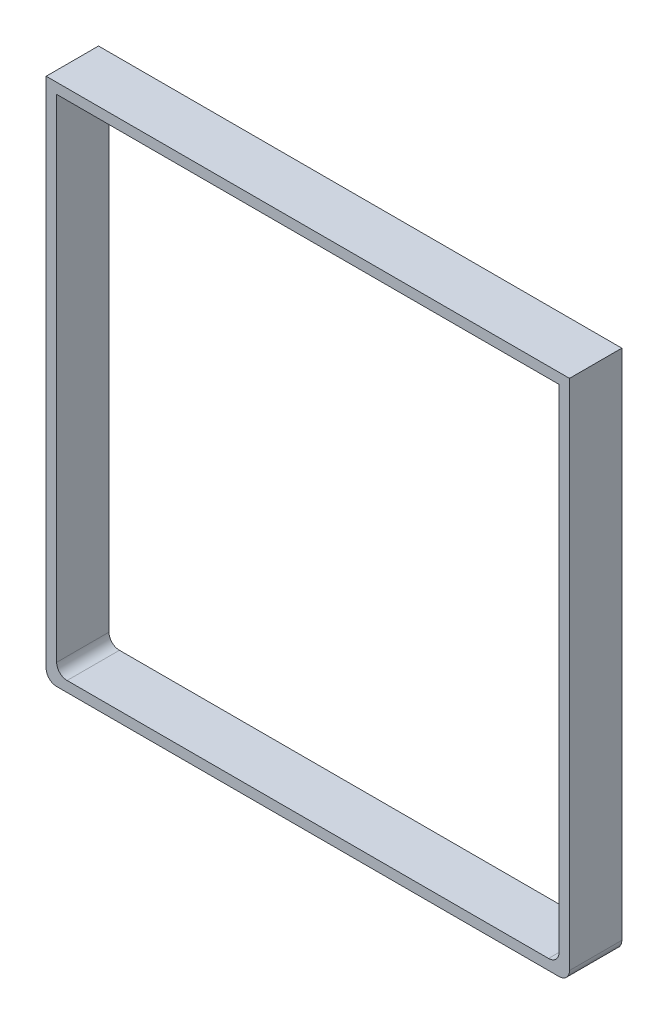
ISO-10303-21;
HEADER;
FILE_DESCRIPTION(('STEP AP214'),'2;1');
FILE_NAME('part.step','',(''),(''),'','','');
FILE_SCHEMA(('AUTOMOTIVE_DESIGN { 1 0 10303 214 1 1 1 1 }'));
ENDSEC;
DATA;
#1=APPLICATION_CONTEXT('core data for automotive mechanical design processes');
#2=APPLICATION_PROTOCOL_DEFINITION('international standard','automotive_design',2000,#1);
#3=PRODUCT_CONTEXT('',#1,'mechanical');
#4=PRODUCT('Part','Part','',(#3));
#5=PRODUCT_RELATED_PRODUCT_CATEGORY('part','',(#4));
#6=PRODUCT_DEFINITION_FORMATION('','',#4);
#7=PRODUCT_DEFINITION_CONTEXT('part definition',#1,'design');
#8=PRODUCT_DEFINITION('design','',#6,#7);
#9=PRODUCT_DEFINITION_SHAPE('','',#8);
#10=(LENGTH_UNIT() NAMED_UNIT(*) SI_UNIT(.MILLI.,.METRE.));
#11=(NAMED_UNIT(*) PLANE_ANGLE_UNIT() SI_UNIT($,.RADIAN.));
#12=(NAMED_UNIT(*) SI_UNIT($,.STERADIAN.) SOLID_ANGLE_UNIT());
#13=UNCERTAINTY_MEASURE_WITH_UNIT(LENGTH_MEASURE(1.E-05),#10,'distance_accuracy_value','');
#14=(GEOMETRIC_REPRESENTATION_CONTEXT(3) GLOBAL_UNCERTAINTY_ASSIGNED_CONTEXT((#13)) GLOBAL_UNIT_ASSIGNED_CONTEXT((#10,
#11,#12)) REPRESENTATION_CONTEXT('',''));
#15=CARTESIAN_POINT('',(0.,0.,0.));
#16=DIRECTION('',(0.,0.,1.));
#17=DIRECTION('',(1.,0.,0.));
#18=AXIS2_PLACEMENT_3D('',#15,#16,#17);
#19=CARTESIAN_POINT('',(490.,10.,50.));
#20=DIRECTION('',(0.,0.,-1.));
#21=DIRECTION('',(-1.,0.,0.));
#22=AXIS2_PLACEMENT_3D('',#19,#20,#21);
#23=PLANE('',#22);
#24=DIRECTION('',(-1.,0.,0.));
#25=VECTOR('',#24,1.);
#26=CARTESIAN_POINT('',(0.,500.,50.));
#27=LINE('',#26,#25);
#28=CARTESIAN_POINT('',(500.,500.,50.));
#29=VERTEX_POINT('',#28);
#30=CARTESIAN_POINT('',(0.,500.,50.));
#31=VERTEX_POINT('',#30);
#32=EDGE_CURVE('E202',#29,#31,#27,.T.);
#33=ORIENTED_EDGE('',*,*,#32,.T.);
#34=DIRECTION('',(0.,-1.,0.));
#35=VECTOR('',#34,1.);
#36=CARTESIAN_POINT('',(0.,10.0000000000001,50.));
#37=LINE('',#36,#35);
#38=CARTESIAN_POINT('',(0.,10.0000000000001,50.));
#39=VERTEX_POINT('',#38);
#40=EDGE_CURVE('E206',#31,#39,#37,.T.);
#41=ORIENTED_EDGE('',*,*,#40,.T.);
#42=CARTESIAN_POINT('',(10.,10.,50.));
#43=DIRECTION('',(0.,0.,1.));
#44=DIRECTION('',(1.,0.,0.));
#45=AXIS2_PLACEMENT_3D('',#42,#43,#44);
#46=CIRCLE('',#45,10.);
#47=CARTESIAN_POINT('',(10.0000000000001,0.,50.));
#48=VERTEX_POINT('',#47);
#49=EDGE_CURVE('E210',#39,#48,#46,.T.);
#50=ORIENTED_EDGE('',*,*,#49,.T.);
#51=DIRECTION('',(1.,0.,0.));
#52=VECTOR('',#51,1.);
#53=CARTESIAN_POINT('',(490.,0.,50.));
#54=LINE('',#53,#52);
#55=CARTESIAN_POINT('',(490.,0.,50.));
#56=VERTEX_POINT('',#55);
#57=EDGE_CURVE('E213',#48,#56,#54,.T.);
#58=ORIENTED_EDGE('',*,*,#57,.T.);
#59=CARTESIAN_POINT('',(490.,10.,50.));
#60=DIRECTION('',(0.,0.,1.));
#61=DIRECTION('',(-1.,0.,0.));
#62=AXIS2_PLACEMENT_3D('',#59,#60,#61);
#63=CIRCLE('',#62,10.);
#64=CARTESIAN_POINT('',(500.,10.0000000000001,50.));
#65=VERTEX_POINT('',#64);
#66=EDGE_CURVE('E216',#56,#65,#63,.T.);
#67=ORIENTED_EDGE('',*,*,#66,.T.);
#68=DIRECTION('',(0.,1.,0.));
#69=VECTOR('',#68,1.);
#70=CARTESIAN_POINT('',(500.,500.,50.));
#71=LINE('',#70,#69);
#72=EDGE_CURVE('E219',#65,#29,#71,.T.);
#73=ORIENTED_EDGE('',*,*,#72,.T.);
#74=EDGE_LOOP('',(#33,#41,#50,#58,#67,#73));
#75=FACE_BOUND('',#74,.T.);
#76=DIRECTION('',(-1.,0.,0.));
#77=VECTOR('',#76,1.);
#78=CARTESIAN_POINT('',(490.,490.,50.));
#79=LINE('',#78,#77);
#80=CARTESIAN_POINT('',(490.,490.,50.));
#81=VERTEX_POINT('',#80);
#82=CARTESIAN_POINT('',(10.,490.,50.));
#83=VERTEX_POINT('',#82);
#84=EDGE_CURVE('E133',#81,#83,#79,.T.);
#85=ORIENTED_EDGE('',*,*,#84,.F.);
#86=DIRECTION('',(0.,1.,0.));
#87=VECTOR('',#86,1.);
#88=CARTESIAN_POINT('',(490.,20.,50.));
#89=LINE('',#88,#87);
#90=CARTESIAN_POINT('',(490.,19.9999999999999,50.));
#91=VERTEX_POINT('',#90);
#92=EDGE_CURVE('E168',#91,#81,#89,.T.);
#93=ORIENTED_EDGE('',*,*,#92,.F.);
#94=CARTESIAN_POINT('',(480.,19.9999999999999,50.));
#95=DIRECTION('',(0.,0.,1.));
#96=DIRECTION('',(1.,0.,0.));
#97=AXIS2_PLACEMENT_3D('',#94,#95,#96);
#98=CIRCLE('',#97,10.);
#99=CARTESIAN_POINT('',(480.,9.99999999999994,50.));
#100=VERTEX_POINT('',#99);
#101=EDGE_CURVE('E165',#100,#91,#98,.T.);
#102=ORIENTED_EDGE('',*,*,#101,.F.);
#103=DIRECTION('',(1.,0.,0.));
#104=VECTOR('',#103,1.);
#105=CARTESIAN_POINT('',(20.0000000000001,9.99999999999994,50.));
#106=LINE('',#105,#104);
#107=CARTESIAN_POINT('',(20.0000000000001,9.99999999999994,50.));
#108=VERTEX_POINT('',#107);
#109=EDGE_CURVE('E160',#108,#100,#106,.T.);
#110=ORIENTED_EDGE('',*,*,#109,.F.);
#111=CARTESIAN_POINT('',(20.,19.9999999999999,50.));
#112=DIRECTION('',(0.,0.,1.));
#113=DIRECTION('',(-1.,0.,0.));
#114=AXIS2_PLACEMENT_3D('',#111,#112,#113);
#115=CIRCLE('',#114,10.);
#116=CARTESIAN_POINT('',(10.,20.,50.));
#117=VERTEX_POINT('',#116);
#118=EDGE_CURVE('E156',#117,#108,#115,.T.);
#119=ORIENTED_EDGE('',*,*,#118,.F.);
#120=DIRECTION('',(0.,-1.,0.));
#121=VECTOR('',#120,1.);
#122=CARTESIAN_POINT('',(10.,490.,50.));
#123=LINE('',#122,#121);
#124=EDGE_CURVE('E142',#83,#117,#123,.T.);
#125=ORIENTED_EDGE('',*,*,#124,.F.);
#126=EDGE_LOOP('',(#85,#93,#102,#110,#119,#125));
#127=FACE_BOUND('',#126,.T.);
#128=ADVANCED_FACE('F43',(#75,#127),#23,.F.);
#129=CARTESIAN_POINT('',(490.,10.,0.));
#130=DIRECTION('',(0.,0.,-1.));
#131=DIRECTION('',(-1.,0.,0.));
#132=AXIS2_PLACEMENT_3D('',#129,#130,#131);
#133=PLANE('',#132);
#134=DIRECTION('',(-1.,0.,0.));
#135=VECTOR('',#134,1.);
#136=CARTESIAN_POINT('',(0.,500.,0.));
#137=LINE('',#136,#135);
#138=CARTESIAN_POINT('',(500.,500.,0.));
#139=VERTEX_POINT('',#138);
#140=CARTESIAN_POINT('',(0.,500.,0.));
#141=VERTEX_POINT('',#140);
#142=EDGE_CURVE('E151',#139,#141,#137,.T.);
#143=ORIENTED_EDGE('',*,*,#142,.F.);
#144=DIRECTION('',(0.,1.,0.));
#145=VECTOR('',#144,1.);
#146=CARTESIAN_POINT('',(500.,500.,0.));
#147=LINE('',#146,#145);
#148=CARTESIAN_POINT('',(500.,10.0000000000001,0.));
#149=VERTEX_POINT('',#148);
#150=EDGE_CURVE('E207',#149,#139,#147,.T.);
#151=ORIENTED_EDGE('',*,*,#150,.F.);
#152=CARTESIAN_POINT('',(490.,10.,0.));
#153=DIRECTION('',(0.,0.,1.));
#154=DIRECTION('',(-1.,0.,0.));
#155=AXIS2_PLACEMENT_3D('',#152,#153,#154);
#156=CIRCLE('',#155,10.);
#157=CARTESIAN_POINT('',(490.,0.,0.));
#158=VERTEX_POINT('',#157);
#159=EDGE_CURVE('E235',#158,#149,#156,.T.);
#160=ORIENTED_EDGE('',*,*,#159,.F.);
#161=DIRECTION('',(1.,0.,0.));
#162=VECTOR('',#161,1.);
#163=CARTESIAN_POINT('',(490.,0.,0.));
#164=LINE('',#163,#162);
#165=CARTESIAN_POINT('',(10.0000000000001,0.,0.));
#166=VERTEX_POINT('',#165);
#167=EDGE_CURVE('E232',#166,#158,#164,.T.);
#168=ORIENTED_EDGE('',*,*,#167,.F.);
#169=CARTESIAN_POINT('',(10.,10.,0.));
#170=DIRECTION('',(0.,0.,1.));
#171=DIRECTION('',(1.,0.,0.));
#172=AXIS2_PLACEMENT_3D('',#169,#170,#171);
#173=CIRCLE('',#172,10.);
#174=CARTESIAN_POINT('',(0.,10.0000000000001,0.));
#175=VERTEX_POINT('',#174);
#176=EDGE_CURVE('E229',#175,#166,#173,.T.);
#177=ORIENTED_EDGE('',*,*,#176,.F.);
#178=DIRECTION('',(0.,-1.,0.));
#179=VECTOR('',#178,1.);
#180=CARTESIAN_POINT('',(0.,10.0000000000001,0.));
#181=LINE('',#180,#179);
#182=EDGE_CURVE('E226',#141,#175,#181,.T.);
#183=ORIENTED_EDGE('',*,*,#182,.F.);
#184=EDGE_LOOP('',(#143,#151,#160,#168,#177,#183));
#185=FACE_BOUND('',#184,.T.);
#186=DIRECTION('',(0.,1.,0.));
#187=VECTOR('',#186,1.);
#188=CARTESIAN_POINT('',(490.,20.,0.));
#189=LINE('',#188,#187);
#190=CARTESIAN_POINT('',(490.,19.9999999999999,0.));
#191=VERTEX_POINT('',#190);
#192=CARTESIAN_POINT('',(490.,490.,0.));
#193=VERTEX_POINT('',#192);
#194=EDGE_CURVE('E143',#191,#193,#189,.T.);
#195=ORIENTED_EDGE('',*,*,#194,.T.);
#196=DIRECTION('',(-1.,0.,0.));
#197=VECTOR('',#196,1.);
#198=CARTESIAN_POINT('',(490.,490.,0.));
#199=LINE('',#198,#197);
#200=CARTESIAN_POINT('',(10.,490.,0.));
#201=VERTEX_POINT('',#200);
#202=EDGE_CURVE('E67',#193,#201,#199,.T.);
#203=ORIENTED_EDGE('',*,*,#202,.T.);
#204=DIRECTION('',(0.,-1.,0.));
#205=VECTOR('',#204,1.);
#206=CARTESIAN_POINT('',(10.,490.,0.));
#207=LINE('',#206,#205);
#208=CARTESIAN_POINT('',(10.,20.,0.));
#209=VERTEX_POINT('',#208);
#210=EDGE_CURVE('E149',#201,#209,#207,.T.);
#211=ORIENTED_EDGE('',*,*,#210,.T.);
#212=CARTESIAN_POINT('',(20.,19.9999999999999,0.));
#213=DIRECTION('',(0.,0.,1.));
#214=DIRECTION('',(-1.,0.,0.));
#215=AXIS2_PLACEMENT_3D('',#212,#213,#214);
#216=CIRCLE('',#215,10.);
#217=CARTESIAN_POINT('',(20.0000000000001,9.99999999999994,0.));
#218=VERTEX_POINT('',#217);
#219=EDGE_CURVE('E175',#209,#218,#216,.T.);
#220=ORIENTED_EDGE('',*,*,#219,.T.);
#221=DIRECTION('',(1.,0.,0.));
#222=VECTOR('',#221,1.);
#223=CARTESIAN_POINT('',(20.0000000000001,9.99999999999994,0.));
#224=LINE('',#223,#222);
#225=CARTESIAN_POINT('',(480.,9.99999999999994,0.));
#226=VERTEX_POINT('',#225);
#227=EDGE_CURVE('E179',#218,#226,#224,.T.);
#228=ORIENTED_EDGE('',*,*,#227,.T.);
#229=CARTESIAN_POINT('',(480.,19.9999999999999,0.));
#230=DIRECTION('',(0.,0.,1.));
#231=DIRECTION('',(1.,0.,0.));
#232=AXIS2_PLACEMENT_3D('',#229,#230,#231);
#233=CIRCLE('',#232,10.);
#234=EDGE_CURVE('E183',#226,#191,#233,.T.);
#235=ORIENTED_EDGE('',*,*,#234,.T.);
#236=EDGE_LOOP('',(#195,#203,#211,#220,#228,#235));
#237=FACE_BOUND('',#236,.T.);
#238=ADVANCED_FACE('F266',(#185,#237),#133,.T.);
#239=CARTESIAN_POINT('',(0.,500.,50.));
#240=DIRECTION('',(0.,-1.,0.));
#241=DIRECTION('',(0.,0.,-1.));
#242=AXIS2_PLACEMENT_3D('',#239,#240,#241);
#243=PLANE('',#242);
#244=ORIENTED_EDGE('',*,*,#142,.T.);
#245=DIRECTION('',(0.,0.,-1.));
#246=VECTOR('',#245,1.);
#247=CARTESIAN_POINT('',(0.,500.,50.));
#248=LINE('',#247,#246);
#249=EDGE_CURVE('E11',#31,#141,#248,.T.);
#250=ORIENTED_EDGE('',*,*,#249,.F.);
#251=ORIENTED_EDGE('',*,*,#32,.F.);
#252=DIRECTION('',(0.,0.,-1.));
#253=VECTOR('',#252,1.);
#254=CARTESIAN_POINT('',(500.,500.,50.));
#255=LINE('',#254,#253);
#256=EDGE_CURVE('E222',#29,#139,#255,.T.);
#257=ORIENTED_EDGE('',*,*,#256,.T.);
#258=EDGE_LOOP('',(#244,#250,#251,#257));
#259=FACE_BOUND('',#258,.T.);
#260=ADVANCED_FACE('F45',(#259),#243,.F.);
#261=CARTESIAN_POINT('',(0.,10.0000000000001,50.));
#262=DIRECTION('',(1.,0.,0.));
#263=DIRECTION('',(0.,0.,-1.));
#264=AXIS2_PLACEMENT_3D('',#261,#262,#263);
#265=PLANE('',#264);
#266=ORIENTED_EDGE('',*,*,#182,.T.);
#267=DIRECTION('',(0.,0.,-1.));
#268=VECTOR('',#267,1.);
#269=CARTESIAN_POINT('',(0.,10.0000000000001,50.));
#270=LINE('',#269,#268);
#271=EDGE_CURVE('E52',#39,#175,#270,.T.);
#272=ORIENTED_EDGE('',*,*,#271,.F.);
#273=ORIENTED_EDGE('',*,*,#40,.F.);
#274=ORIENTED_EDGE('',*,*,#249,.T.);
#275=EDGE_LOOP('',(#266,#272,#273,#274));
#276=FACE_BOUND('',#275,.T.);
#277=ADVANCED_FACE('F283',(#276),#265,.F.);
#278=CARTESIAN_POINT('',(10.,10.,50.));
#279=DIRECTION('',(0.,0.,-1.));
#280=DIRECTION('',(-1.,0.,0.));
#281=AXIS2_PLACEMENT_3D('',#278,#279,#280);
#282=CYLINDRICAL_SURFACE('',#281,10.);
#283=ORIENTED_EDGE('',*,*,#176,.T.);
#284=DIRECTION('',(0.,0.,-1.));
#285=VECTOR('',#284,1.);
#286=CARTESIAN_POINT('',(10.0000000000001,0.,50.));
#287=LINE('',#286,#285);
#288=EDGE_CURVE('E251',#48,#166,#287,.T.);
#289=ORIENTED_EDGE('',*,*,#288,.F.);
#290=ORIENTED_EDGE('',*,*,#49,.F.);
#291=ORIENTED_EDGE('',*,*,#271,.T.);
#292=EDGE_LOOP('',(#283,#289,#290,#291));
#293=FACE_BOUND('',#292,.T.);
#294=ADVANCED_FACE('F260',(#293),#282,.T.);
#295=CARTESIAN_POINT('',(490.,0.,50.));
#296=DIRECTION('',(0.,1.,0.));
#297=DIRECTION('',(-1.,0.,0.));
#298=AXIS2_PLACEMENT_3D('',#295,#296,#297);
#299=PLANE('',#298);
#300=ORIENTED_EDGE('',*,*,#167,.T.);
#301=DIRECTION('',(0.,0.,-1.));
#302=VECTOR('',#301,1.);
#303=CARTESIAN_POINT('',(490.,0.,50.));
#304=LINE('',#303,#302);
#305=EDGE_CURVE('E247',#56,#158,#304,.T.);
#306=ORIENTED_EDGE('',*,*,#305,.F.);
#307=ORIENTED_EDGE('',*,*,#57,.F.);
#308=ORIENTED_EDGE('',*,*,#288,.T.);
#309=EDGE_LOOP('',(#300,#306,#307,#308));
#310=FACE_BOUND('',#309,.T.);
#311=ADVANCED_FACE('F272',(#310),#299,.F.);
#312=CARTESIAN_POINT('',(490.,10.,50.));
#313=DIRECTION('',(0.,0.,-1.));
#314=DIRECTION('',(-1.,0.,0.));
#315=AXIS2_PLACEMENT_3D('',#312,#313,#314);
#316=CYLINDRICAL_SURFACE('',#315,10.);
#317=ORIENTED_EDGE('',*,*,#159,.T.);
#318=DIRECTION('',(0.,0.,-1.));
#319=VECTOR('',#318,1.);
#320=CARTESIAN_POINT('',(500.,10.0000000000001,50.));
#321=LINE('',#320,#319);
#322=EDGE_CURVE('E243',#65,#149,#321,.T.);
#323=ORIENTED_EDGE('',*,*,#322,.F.);
#324=ORIENTED_EDGE('',*,*,#66,.F.);
#325=ORIENTED_EDGE('',*,*,#305,.T.);
#326=EDGE_LOOP('',(#317,#323,#324,#325));
#327=FACE_BOUND('',#326,.T.);
#328=ADVANCED_FACE('F276',(#327),#316,.T.);
#329=CARTESIAN_POINT('',(500.,500.,50.));
#330=DIRECTION('',(-1.,0.,0.));
#331=DIRECTION('',(0.,-1.,0.));
#332=AXIS2_PLACEMENT_3D('',#329,#330,#331);
#333=PLANE('',#332);
#334=ORIENTED_EDGE('',*,*,#150,.T.);
#335=ORIENTED_EDGE('',*,*,#256,.F.);
#336=ORIENTED_EDGE('',*,*,#72,.F.);
#337=ORIENTED_EDGE('',*,*,#322,.T.);
#338=EDGE_LOOP('',(#334,#335,#336,#337));
#339=FACE_BOUND('',#338,.T.);
#340=ADVANCED_FACE('F286',(#339),#333,.F.);
#341=CARTESIAN_POINT('',(490.,490.,50.));
#342=DIRECTION('',(0.,-1.,0.));
#343=DIRECTION('',(1.,0.,0.));
#344=AXIS2_PLACEMENT_3D('',#341,#342,#343);
#345=PLANE('',#344);
#346=ORIENTED_EDGE('',*,*,#202,.F.);
#347=DIRECTION('',(0.,0.,-1.));
#348=VECTOR('',#347,1.);
#349=CARTESIAN_POINT('',(490.,490.,50.));
#350=LINE('',#349,#348);
#351=EDGE_CURVE('E137',#81,#193,#350,.T.);
#352=ORIENTED_EDGE('',*,*,#351,.F.);
#353=ORIENTED_EDGE('',*,*,#84,.T.);
#354=DIRECTION('',(0.,0.,-1.));
#355=VECTOR('',#354,1.);
#356=CARTESIAN_POINT('',(10.,490.,50.));
#357=LINE('',#356,#355);
#358=EDGE_CURVE('E136',#83,#201,#357,.T.);
#359=ORIENTED_EDGE('',*,*,#358,.T.);
#360=EDGE_LOOP('',(#346,#352,#353,#359));
#361=FACE_BOUND('',#360,.T.);
#362=ADVANCED_FACE('F135',(#361),#345,.T.);
#363=CARTESIAN_POINT('',(10.,490.,50.));
#364=DIRECTION('',(1.,0.,0.));
#365=DIRECTION('',(0.,1.,0.));
#366=AXIS2_PLACEMENT_3D('',#363,#364,#365);
#367=PLANE('',#366);
#368=ORIENTED_EDGE('',*,*,#210,.F.);
#369=ORIENTED_EDGE('',*,*,#358,.F.);
#370=ORIENTED_EDGE('',*,*,#124,.T.);
#371=DIRECTION('',(0.,0.,-1.));
#372=VECTOR('',#371,1.);
#373=CARTESIAN_POINT('',(10.,20.,50.));
#374=LINE('',#373,#372);
#375=EDGE_CURVE('E152',#117,#209,#374,.T.);
#376=ORIENTED_EDGE('',*,*,#375,.T.);
#377=EDGE_LOOP('',(#368,#369,#370,#376));
#378=FACE_BOUND('',#377,.T.);
#379=ADVANCED_FACE('F146',(#378),#367,.T.);
#380=CARTESIAN_POINT('',(20.,19.9999999999999,50.));
#381=DIRECTION('',(0.,0.,-1.));
#382=DIRECTION('',(-1.,0.,0.));
#383=AXIS2_PLACEMENT_3D('',#380,#381,#382);
#384=CYLINDRICAL_SURFACE('',#383,10.);
#385=ORIENTED_EDGE('',*,*,#219,.F.);
#386=ORIENTED_EDGE('',*,*,#375,.F.);
#387=ORIENTED_EDGE('',*,*,#118,.T.);
#388=DIRECTION('',(0.,0.,-1.));
#389=VECTOR('',#388,1.);
#390=CARTESIAN_POINT('',(20.0000000000001,9.99999999999994,50.));
#391=LINE('',#390,#389);
#392=EDGE_CURVE('E197',#108,#218,#391,.T.);
#393=ORIENTED_EDGE('',*,*,#392,.T.);
#394=EDGE_LOOP('',(#385,#386,#387,#393));
#395=FACE_BOUND('',#394,.T.);
#396=ADVANCED_FACE('F304',(#395),#384,.F.);
#397=CARTESIAN_POINT('',(20.0000000000001,9.99999999999994,50.));
#398=DIRECTION('',(0.,1.,0.));
#399=DIRECTION('',(0.,0.,1.));
#400=AXIS2_PLACEMENT_3D('',#397,#398,#399);
#401=PLANE('',#400);
#402=ORIENTED_EDGE('',*,*,#227,.F.);
#403=ORIENTED_EDGE('',*,*,#392,.F.);
#404=ORIENTED_EDGE('',*,*,#109,.T.);
#405=DIRECTION('',(0.,0.,-1.));
#406=VECTOR('',#405,1.);
#407=CARTESIAN_POINT('',(480.,9.99999999999994,50.));
#408=LINE('',#407,#406);
#409=EDGE_CURVE('E194',#100,#226,#408,.T.);
#410=ORIENTED_EDGE('',*,*,#409,.T.);
#411=EDGE_LOOP('',(#402,#403,#404,#410));
#412=FACE_BOUND('',#411,.T.);
#413=ADVANCED_FACE('F307',(#412),#401,.T.);
#414=CARTESIAN_POINT('',(480.,19.9999999999999,50.));
#415=DIRECTION('',(0.,0.,-1.));
#416=DIRECTION('',(-1.,0.,0.));
#417=AXIS2_PLACEMENT_3D('',#414,#415,#416);
#418=CYLINDRICAL_SURFACE('',#417,10.);
#419=ORIENTED_EDGE('',*,*,#234,.F.);
#420=ORIENTED_EDGE('',*,*,#409,.F.);
#421=ORIENTED_EDGE('',*,*,#101,.T.);
#422=DIRECTION('',(0.,0.,-1.));
#423=VECTOR('',#422,1.);
#424=CARTESIAN_POINT('',(490.,19.9999999999999,50.));
#425=LINE('',#424,#423);
#426=EDGE_CURVE('E59',#91,#191,#425,.T.);
#427=ORIENTED_EDGE('',*,*,#426,.T.);
#428=EDGE_LOOP('',(#419,#420,#421,#427));
#429=FACE_BOUND('',#428,.T.);
#430=ADVANCED_FACE('F311',(#429),#418,.F.);
#431=CARTESIAN_POINT('',(490.,20.,50.));
#432=DIRECTION('',(-1.,0.,0.));
#433=DIRECTION('',(0.,0.,1.));
#434=AXIS2_PLACEMENT_3D('',#431,#432,#433);
#435=PLANE('',#434);
#436=ORIENTED_EDGE('',*,*,#194,.F.);
#437=ORIENTED_EDGE('',*,*,#426,.F.);
#438=ORIENTED_EDGE('',*,*,#92,.T.);
#439=ORIENTED_EDGE('',*,*,#351,.T.);
#440=EDGE_LOOP('',(#436,#437,#438,#439));
#441=FACE_BOUND('',#440,.T.);
#442=ADVANCED_FACE('F315',(#441),#435,.T.);
#443=CLOSED_SHELL('',(#128,#238,#260,#277,#294,#311,#328,#340,#362,#379,#396,#413,#430,#442));
#444=MANIFOLD_SOLID_BREP('B2',#443);
#445=ADVANCED_BREP_SHAPE_REPRESENTATION('',(#18,#444),#14);
#446=SHAPE_DEFINITION_REPRESENTATION(#9,#445);
ENDSEC;
END-ISO-10303-21;
